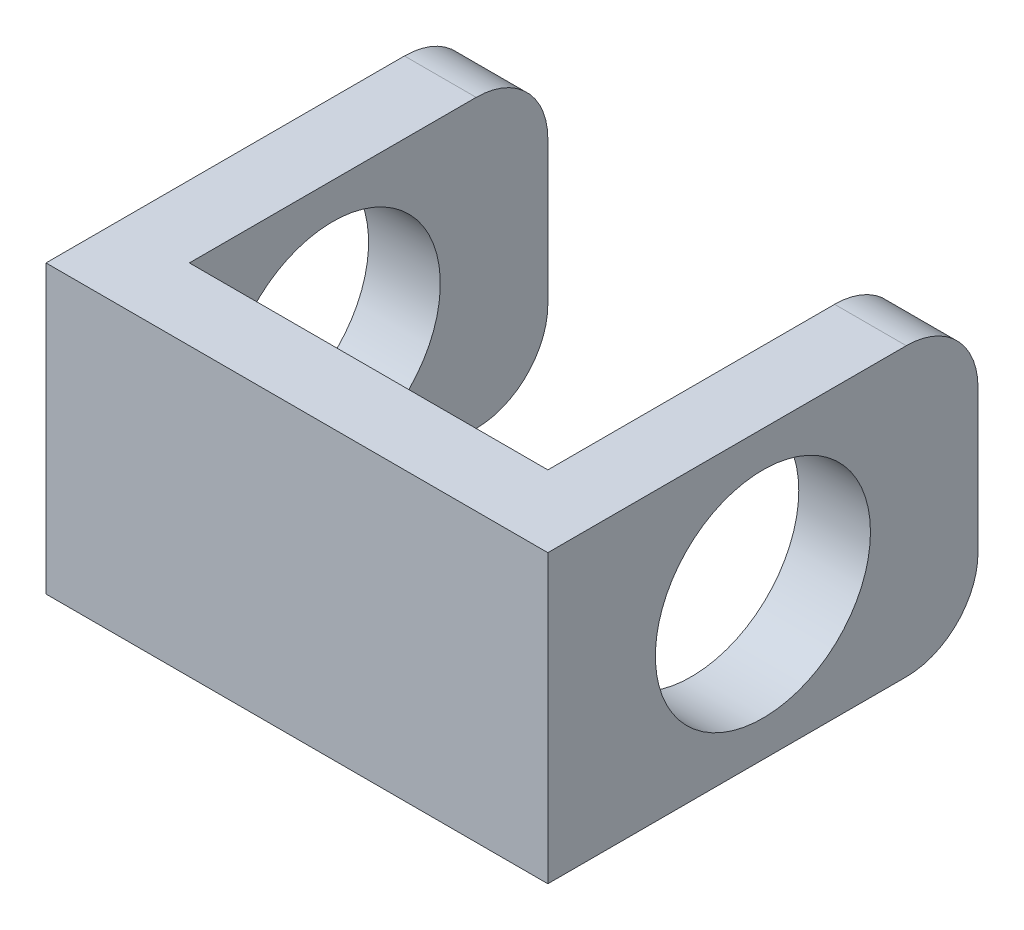
ISO-10303-21;
HEADER;
FILE_DESCRIPTION(('STEP AP214'),'2;1');
FILE_NAME('part.step','',(''),(''),'','','');
FILE_SCHEMA(('AUTOMOTIVE_DESIGN { 1 0 10303 214 1 1 1 1 }'));
ENDSEC;
DATA;
#1=APPLICATION_CONTEXT('core data for automotive mechanical design processes');
#2=APPLICATION_PROTOCOL_DEFINITION('international standard','automotive_design',2000,#1);
#3=PRODUCT_CONTEXT('',#1,'mechanical');
#4=PRODUCT('Part','Part','',(#3));
#5=PRODUCT_RELATED_PRODUCT_CATEGORY('part','',(#4));
#6=PRODUCT_DEFINITION_FORMATION('','',#4);
#7=PRODUCT_DEFINITION_CONTEXT('part definition',#1,'design');
#8=PRODUCT_DEFINITION('design','',#6,#7);
#9=PRODUCT_DEFINITION_SHAPE('','',#8);
#10=(LENGTH_UNIT() NAMED_UNIT(*) SI_UNIT(.MILLI.,.METRE.));
#11=(NAMED_UNIT(*) PLANE_ANGLE_UNIT() SI_UNIT($,.RADIAN.));
#12=(NAMED_UNIT(*) SI_UNIT($,.STERADIAN.) SOLID_ANGLE_UNIT());
#13=UNCERTAINTY_MEASURE_WITH_UNIT(LENGTH_MEASURE(1.E-05),#10,'distance_accuracy_value','');
#14=(GEOMETRIC_REPRESENTATION_CONTEXT(3) GLOBAL_UNCERTAINTY_ASSIGNED_CONTEXT((#13)) GLOBAL_UNIT_ASSIGNED_CONTEXT((#10,
#11,#12)) REPRESENTATION_CONTEXT('',''));
#15=CARTESIAN_POINT('',(0.,0.,0.));
#16=DIRECTION('',(0.,0.,1.));
#17=DIRECTION('',(1.,0.,0.));
#18=AXIS2_PLACEMENT_3D('',#15,#16,#17);
#19=CARTESIAN_POINT('',(0.,0.,0.));
#20=DIRECTION('',(0.,0.,-1.));
#21=DIRECTION('',(-1.,0.,0.));
#22=AXIS2_PLACEMENT_3D('',#19,#20,#21);
#23=PLANE('',#22);
#24=DIRECTION('',(-1.,0.,0.));
#25=VECTOR('',#24,1.);
#26=CARTESIAN_POINT('',(60.,40.,0.));
#27=LINE('',#26,#25);
#28=CARTESIAN_POINT('',(50.,40.,0.));
#29=VERTEX_POINT('',#28);
#30=CARTESIAN_POINT('',(0.,40.,0.));
#31=VERTEX_POINT('',#30);
#32=EDGE_CURVE('E187',#29,#31,#27,.T.);
#33=ORIENTED_EDGE('',*,*,#32,.F.);
#34=DIRECTION('',(0.,1.,0.));
#35=VECTOR('',#34,1.);
#36=CARTESIAN_POINT('',(50.,0.,0.));
#37=LINE('',#36,#35);
#38=CARTESIAN_POINT('',(50.,0.,0.));
#39=VERTEX_POINT('',#38);
#40=EDGE_CURVE('E153',#39,#29,#37,.T.);
#41=ORIENTED_EDGE('',*,*,#40,.F.);
#42=DIRECTION('',(1.,0.,0.));
#43=VECTOR('',#42,1.);
#44=CARTESIAN_POINT('',(60.,0.,0.));
#45=LINE('',#44,#43);
#46=CARTESIAN_POINT('',(0.,0.,0.));
#47=VERTEX_POINT('',#46);
#48=EDGE_CURVE('E189',#47,#39,#45,.T.);
#49=ORIENTED_EDGE('',*,*,#48,.F.);
#50=DIRECTION('',(0.,-1.,0.));
#51=VECTOR('',#50,1.);
#52=CARTESIAN_POINT('',(0.,0.,0.));
#53=LINE('',#52,#51);
#54=EDGE_CURVE('E144',#31,#47,#53,.T.);
#55=ORIENTED_EDGE('',*,*,#54,.F.);
#56=EDGE_LOOP('',(#33,#41,#49,#55));
#57=FACE_BOUND('',#56,.T.);
#58=ADVANCED_FACE('F37',(#57),#23,.T.);
#59=CARTESIAN_POINT('',(-10.,40.,0.));
#60=DIRECTION('',(0.,1.,0.));
#61=DIRECTION('',(0.,0.,1.));
#62=AXIS2_PLACEMENT_3D('',#59,#60,#61);
#63=PLANE('',#62);
#64=ORIENTED_EDGE('',*,*,#32,.T.);
#65=DIRECTION('',(0.,0.,1.));
#66=VECTOR('',#65,1.);
#67=CARTESIAN_POINT('',(0.,40.,0.));
#68=LINE('',#67,#66);
#69=CARTESIAN_POINT('',(0.,40.,-39.9999999999999));
#70=VERTEX_POINT('',#69);
#71=EDGE_CURVE('E204',#70,#31,#68,.T.);
#72=ORIENTED_EDGE('',*,*,#71,.F.);
#73=DIRECTION('',(1.,0.,0.));
#74=VECTOR('',#73,1.);
#75=CARTESIAN_POINT('',(-10.,40.,-39.9999999999999));
#76=LINE('',#75,#74);
#77=CARTESIAN_POINT('',(-10.,40.,-39.9999999999999));
#78=VERTEX_POINT('',#77);
#79=EDGE_CURVE('E11',#78,#70,#76,.T.);
#80=ORIENTED_EDGE('',*,*,#79,.F.);
#81=DIRECTION('',(0.,0.,1.));
#82=VECTOR('',#81,1.);
#83=CARTESIAN_POINT('',(-10.,40.,0.));
#84=LINE('',#83,#82);
#85=CARTESIAN_POINT('',(-10.,40.,10.));
#86=VERTEX_POINT('',#85);
#87=EDGE_CURVE('E210',#78,#86,#84,.T.);
#88=ORIENTED_EDGE('',*,*,#87,.T.);
#89=DIRECTION('',(-1.,0.,0.));
#90=VECTOR('',#89,1.);
#91=CARTESIAN_POINT('',(60.,40.,10.));
#92=LINE('',#91,#90);
#93=CARTESIAN_POINT('',(60.,40.,10.));
#94=VERTEX_POINT('',#93);
#95=EDGE_CURVE('E193',#94,#86,#92,.T.);
#96=ORIENTED_EDGE('',*,*,#95,.F.);
#97=DIRECTION('',(0.,0.,1.));
#98=VECTOR('',#97,1.);
#99=CARTESIAN_POINT('',(60.,40.,0.));
#100=LINE('',#99,#98);
#101=CARTESIAN_POINT('',(60.,40.,-39.9999999999999));
#102=VERTEX_POINT('',#101);
#103=EDGE_CURVE('E145',#102,#94,#100,.T.);
#104=ORIENTED_EDGE('',*,*,#103,.F.);
#105=DIRECTION('',(-1.,0.,0.));
#106=VECTOR('',#105,1.);
#107=CARTESIAN_POINT('',(60.,40.,-39.9999999999999));
#108=LINE('',#107,#106);
#109=CARTESIAN_POINT('',(50.,40.,-39.9999999999999));
#110=VERTEX_POINT('',#109);
#111=EDGE_CURVE('E173',#102,#110,#108,.T.);
#112=ORIENTED_EDGE('',*,*,#111,.T.);
#113=DIRECTION('',(0.,0.,1.));
#114=VECTOR('',#113,1.);
#115=CARTESIAN_POINT('',(50.,40.,10.));
#116=LINE('',#115,#114);
#117=EDGE_CURVE('E160',#110,#29,#116,.T.);
#118=ORIENTED_EDGE('',*,*,#117,.T.);
#119=EDGE_LOOP('',(#64,#72,#80,#88,#96,#104,#112,#118));
#120=FACE_BOUND('',#119,.T.);
#121=ADVANCED_FACE('F241',(#120),#63,.T.);
#122=CARTESIAN_POINT('',(-10.,30.,-40.));
#123=DIRECTION('',(1.,0.,0.));
#124=DIRECTION('',(0.,0.,-1.));
#125=AXIS2_PLACEMENT_3D('',#122,#123,#124);
#126=CYLINDRICAL_SURFACE('',#125,10.);
#127=CARTESIAN_POINT('',(0.,30.,-40.));
#128=DIRECTION('',(1.,0.,0.));
#129=DIRECTION('',(0.,0.,1.));
#130=AXIS2_PLACEMENT_3D('',#127,#128,#129);
#131=CIRCLE('',#130,10.);
#132=CARTESIAN_POINT('',(0.,29.9999999999999,-50.));
#133=VERTEX_POINT('',#132);
#134=EDGE_CURVE('E223',#133,#70,#131,.T.);
#135=ORIENTED_EDGE('',*,*,#134,.F.);
#136=DIRECTION('',(1.,0.,0.));
#137=VECTOR('',#136,1.);
#138=CARTESIAN_POINT('',(-10.,29.9999999999999,-50.));
#139=LINE('',#138,#137);
#140=CARTESIAN_POINT('',(-10.,29.9999999999999,-50.));
#141=VERTEX_POINT('',#140);
#142=EDGE_CURVE('E47',#141,#133,#139,.T.);
#143=ORIENTED_EDGE('',*,*,#142,.F.);
#144=CARTESIAN_POINT('',(-10.,30.,-40.));
#145=DIRECTION('',(1.,0.,0.));
#146=DIRECTION('',(0.,0.,1.));
#147=AXIS2_PLACEMENT_3D('',#144,#145,#146);
#148=CIRCLE('',#147,10.);
#149=EDGE_CURVE('E208',#141,#78,#148,.T.);
#150=ORIENTED_EDGE('',*,*,#149,.T.);
#151=ORIENTED_EDGE('',*,*,#79,.T.);
#152=EDGE_LOOP('',(#135,#143,#150,#151));
#153=FACE_BOUND('',#152,.T.);
#154=ADVANCED_FACE('F260',(#153),#126,.T.);
#155=CARTESIAN_POINT('',(-10.,10.0000000000001,-50.));
#156=DIRECTION('',(0.,0.,-1.));
#157=DIRECTION('',(-1.,0.,0.));
#158=AXIS2_PLACEMENT_3D('',#155,#156,#157);
#159=PLANE('',#158);
#160=DIRECTION('',(0.,1.,0.));
#161=VECTOR('',#160,1.);
#162=CARTESIAN_POINT('',(0.,10.0000000000001,-50.));
#163=LINE('',#162,#161);
#164=CARTESIAN_POINT('',(0.,10.0000000000001,-50.));
#165=VERTEX_POINT('',#164);
#166=EDGE_CURVE('E220',#165,#133,#163,.T.);
#167=ORIENTED_EDGE('',*,*,#166,.F.);
#168=DIRECTION('',(1.,0.,0.));
#169=VECTOR('',#168,1.);
#170=CARTESIAN_POINT('',(-10.,10.0000000000001,-50.));
#171=LINE('',#170,#169);
#172=CARTESIAN_POINT('',(-10.,10.0000000000001,-50.));
#173=VERTEX_POINT('',#172);
#174=EDGE_CURVE('E228',#173,#165,#171,.T.);
#175=ORIENTED_EDGE('',*,*,#174,.F.);
#176=DIRECTION('',(0.,1.,0.));
#177=VECTOR('',#176,1.);
#178=CARTESIAN_POINT('',(-10.,10.0000000000001,-50.));
#179=LINE('',#178,#177);
#180=EDGE_CURVE('E206',#173,#141,#179,.T.);
#181=ORIENTED_EDGE('',*,*,#180,.T.);
#182=ORIENTED_EDGE('',*,*,#142,.T.);
#183=EDGE_LOOP('',(#167,#175,#181,#182));
#184=FACE_BOUND('',#183,.T.);
#185=ADVANCED_FACE('F259',(#184),#159,.T.);
#186=CARTESIAN_POINT('',(-10.,10.,-40.));
#187=DIRECTION('',(1.,0.,0.));
#188=DIRECTION('',(0.,0.,-1.));
#189=AXIS2_PLACEMENT_3D('',#186,#187,#188);
#190=CYLINDRICAL_SURFACE('',#189,10.);
#191=CARTESIAN_POINT('',(0.,10.,-40.));
#192=DIRECTION('',(1.,0.,0.));
#193=DIRECTION('',(0.,0.,1.));
#194=AXIS2_PLACEMENT_3D('',#191,#192,#193);
#195=CIRCLE('',#194,10.);
#196=CARTESIAN_POINT('',(0.,0.,-39.9999999999999));
#197=VERTEX_POINT('',#196);
#198=EDGE_CURVE('E217',#197,#165,#195,.T.);
#199=ORIENTED_EDGE('',*,*,#198,.F.);
#200=DIRECTION('',(1.,0.,0.));
#201=VECTOR('',#200,1.);
#202=CARTESIAN_POINT('',(-10.,0.,-39.9999999999999));
#203=LINE('',#202,#201);
#204=CARTESIAN_POINT('',(-10.,0.,-39.9999999999999));
#205=VERTEX_POINT('',#204);
#206=EDGE_CURVE('E84',#205,#197,#203,.T.);
#207=ORIENTED_EDGE('',*,*,#206,.F.);
#208=CARTESIAN_POINT('',(-10.,10.,-40.));
#209=DIRECTION('',(1.,0.,0.));
#210=DIRECTION('',(0.,0.,1.));
#211=AXIS2_PLACEMENT_3D('',#208,#209,#210);
#212=CIRCLE('',#211,10.);
#213=EDGE_CURVE('E203',#205,#173,#212,.T.);
#214=ORIENTED_EDGE('',*,*,#213,.T.);
#215=ORIENTED_EDGE('',*,*,#174,.T.);
#216=EDGE_LOOP('',(#199,#207,#214,#215));
#217=FACE_BOUND('',#216,.T.);
#218=ADVANCED_FACE('F230',(#217),#190,.T.);
#219=CARTESIAN_POINT('',(-10.,0.,0.));
#220=DIRECTION('',(0.,-1.,0.));
#221=DIRECTION('',(0.,0.,-1.));
#222=AXIS2_PLACEMENT_3D('',#219,#220,#221);
#223=PLANE('',#222);
#224=DIRECTION('',(0.,0.,1.));
#225=VECTOR('',#224,1.);
#226=CARTESIAN_POINT('',(60.,0.,0.));
#227=LINE('',#226,#225);
#228=CARTESIAN_POINT('',(60.,0.,-39.9999999999999));
#229=VERTEX_POINT('',#228);
#230=CARTESIAN_POINT('',(60.,0.,10.));
#231=VERTEX_POINT('',#230);
#232=EDGE_CURVE('E134',#229,#231,#227,.T.);
#233=ORIENTED_EDGE('',*,*,#232,.T.);
#234=DIRECTION('',(1.,0.,0.));
#235=VECTOR('',#234,1.);
#236=CARTESIAN_POINT('',(60.,0.,10.));
#237=LINE('',#236,#235);
#238=CARTESIAN_POINT('',(-10.,0.,10.));
#239=VERTEX_POINT('',#238);
#240=EDGE_CURVE('E190',#239,#231,#237,.T.);
#241=ORIENTED_EDGE('',*,*,#240,.F.);
#242=DIRECTION('',(0.,0.,-1.));
#243=VECTOR('',#242,1.);
#244=CARTESIAN_POINT('',(-10.,0.,0.));
#245=LINE('',#244,#243);
#246=EDGE_CURVE('E200',#239,#205,#245,.T.);
#247=ORIENTED_EDGE('',*,*,#246,.T.);
#248=ORIENTED_EDGE('',*,*,#206,.T.);
#249=DIRECTION('',(0.,0.,-1.));
#250=VECTOR('',#249,1.);
#251=CARTESIAN_POINT('',(0.,0.,0.));
#252=LINE('',#251,#250);
#253=EDGE_CURVE('E214',#47,#197,#252,.T.);
#254=ORIENTED_EDGE('',*,*,#253,.F.);
#255=ORIENTED_EDGE('',*,*,#48,.T.);
#256=DIRECTION('',(0.,0.,-1.));
#257=VECTOR('',#256,1.);
#258=CARTESIAN_POINT('',(50.,0.,10.));
#259=LINE('',#258,#257);
#260=CARTESIAN_POINT('',(50.,0.,-39.9999999999999));
#261=VERTEX_POINT('',#260);
#262=EDGE_CURVE('E150',#39,#261,#259,.T.);
#263=ORIENTED_EDGE('',*,*,#262,.T.);
#264=DIRECTION('',(-1.,0.,0.));
#265=VECTOR('',#264,1.);
#266=CARTESIAN_POINT('',(60.,0.,-39.9999999999999));
#267=LINE('',#266,#265);
#268=EDGE_CURVE('E148',#229,#261,#267,.T.);
#269=ORIENTED_EDGE('',*,*,#268,.F.);
#270=EDGE_LOOP('',(#233,#241,#247,#248,#254,#255,#263,#269));
#271=FACE_BOUND('',#270,.T.);
#272=ADVANCED_FACE('F39',(#271),#223,.T.);
#273=CARTESIAN_POINT('',(-10.,30.,-40.));
#274=DIRECTION('',(-1.,0.,0.));
#275=DIRECTION('',(0.,0.,1.));
#276=AXIS2_PLACEMENT_3D('',#273,#274,#275);
#277=PLANE('',#276);
#278=CARTESIAN_POINT('',(-9.99999999999999,20.,-20.));
#279=DIRECTION('',(-1.,0.,0.));
#280=DIRECTION('',(0.,0.,1.));
#281=AXIS2_PLACEMENT_3D('',#278,#279,#280);
#282=CIRCLE('',#281,15.);
#283=CARTESIAN_POINT('',(-9.99999999999999,20.,-5.00000000000001));
#284=VERTEX_POINT('',#283);
#285=EDGE_CURVE('E168',#284,#284,#282,.T.);
#286=ORIENTED_EDGE('',*,*,#285,.F.);
#287=EDGE_LOOP('',(#286));
#288=FACE_BOUND('',#287,.T.);
#289=ORIENTED_EDGE('',*,*,#246,.F.);
#290=DIRECTION('',(0.,-1.,0.));
#291=VECTOR('',#290,1.);
#292=CARTESIAN_POINT('',(-10.,40.,10.));
#293=LINE('',#292,#291);
#294=EDGE_CURVE('E195',#86,#239,#293,.T.);
#295=ORIENTED_EDGE('',*,*,#294,.F.);
#296=ORIENTED_EDGE('',*,*,#87,.F.);
#297=ORIENTED_EDGE('',*,*,#149,.F.);
#298=ORIENTED_EDGE('',*,*,#180,.F.);
#299=ORIENTED_EDGE('',*,*,#213,.F.);
#300=EDGE_LOOP('',(#289,#295,#296,#297,#298,#299));
#301=FACE_BOUND('',#300,.T.);
#302=ADVANCED_FACE('F256',(#288,#301),#277,.T.);
#303=CARTESIAN_POINT('',(0.,30.,-40.));
#304=DIRECTION('',(-1.,0.,0.));
#305=DIRECTION('',(0.,0.,1.));
#306=AXIS2_PLACEMENT_3D('',#303,#304,#305);
#307=PLANE('',#306);
#308=CARTESIAN_POINT('',(0.,20.,-20.));
#309=DIRECTION('',(-1.,0.,0.));
#310=DIRECTION('',(0.,0.,1.));
#311=AXIS2_PLACEMENT_3D('',#308,#309,#310);
#312=CIRCLE('',#311,15.);
#313=CARTESIAN_POINT('',(0.,20.,-5.00000000000001));
#314=VERTEX_POINT('',#313);
#315=EDGE_CURVE('E290',#314,#314,#312,.T.);
#316=ORIENTED_EDGE('',*,*,#315,.T.);
#317=EDGE_LOOP('',(#316));
#318=FACE_BOUND('',#317,.T.);
#319=ORIENTED_EDGE('',*,*,#54,.T.);
#320=ORIENTED_EDGE('',*,*,#253,.T.);
#321=ORIENTED_EDGE('',*,*,#198,.T.);
#322=ORIENTED_EDGE('',*,*,#166,.T.);
#323=ORIENTED_EDGE('',*,*,#134,.T.);
#324=ORIENTED_EDGE('',*,*,#71,.T.);
#325=EDGE_LOOP('',(#319,#320,#321,#322,#323,#324));
#326=FACE_BOUND('',#325,.T.);
#327=ADVANCED_FACE('F232',(#318,#326),#307,.F.);
#328=CARTESIAN_POINT('',(60.,40.,0.));
#329=DIRECTION('',(1.,0.,0.));
#330=DIRECTION('',(0.,0.,-1.));
#331=AXIS2_PLACEMENT_3D('',#328,#329,#330);
#332=PLANE('',#331);
#333=CARTESIAN_POINT('',(60.,20.,-20.));
#334=DIRECTION('',(1.,0.,0.));
#335=DIRECTION('',(0.,0.,-1.));
#336=AXIS2_PLACEMENT_3D('',#333,#334,#335);
#337=CIRCLE('',#336,15.);
#338=CARTESIAN_POINT('',(60.,20.,-35.));
#339=VERTEX_POINT('',#338);
#340=EDGE_CURVE('E294',#339,#339,#337,.T.);
#341=ORIENTED_EDGE('',*,*,#340,.F.);
#342=EDGE_LOOP('',(#341));
#343=FACE_BOUND('',#342,.T.);
#344=DIRECTION('',(0.,1.,0.));
#345=VECTOR('',#344,1.);
#346=CARTESIAN_POINT('',(60.,40.,10.));
#347=LINE('',#346,#345);
#348=EDGE_CURVE('E141',#231,#94,#347,.T.);
#349=ORIENTED_EDGE('',*,*,#348,.F.);
#350=ORIENTED_EDGE('',*,*,#232,.F.);
#351=CARTESIAN_POINT('',(60.,10.,-40.));
#352=DIRECTION('',(1.,0.,0.));
#353=DIRECTION('',(0.,0.,-1.));
#354=AXIS2_PLACEMENT_3D('',#351,#352,#353);
#355=CIRCLE('',#354,10.);
#356=CARTESIAN_POINT('',(60.,10.0000000000001,-50.));
#357=VERTEX_POINT('',#356);
#358=EDGE_CURVE('E138',#229,#357,#355,.T.);
#359=ORIENTED_EDGE('',*,*,#358,.T.);
#360=DIRECTION('',(0.,1.,0.));
#361=VECTOR('',#360,1.);
#362=CARTESIAN_POINT('',(60.,29.9999999999999,-50.));
#363=LINE('',#362,#361);
#364=CARTESIAN_POINT('',(60.,29.9999999999999,-50.));
#365=VERTEX_POINT('',#364);
#366=EDGE_CURVE('E159',#357,#365,#363,.T.);
#367=ORIENTED_EDGE('',*,*,#366,.T.);
#368=CARTESIAN_POINT('',(60.,30.,-40.));
#369=DIRECTION('',(1.,0.,0.));
#370=DIRECTION('',(0.,0.,-1.));
#371=AXIS2_PLACEMENT_3D('',#368,#369,#370);
#372=CIRCLE('',#371,10.);
#373=EDGE_CURVE('E162',#365,#102,#372,.T.);
#374=ORIENTED_EDGE('',*,*,#373,.T.);
#375=ORIENTED_EDGE('',*,*,#103,.T.);
#376=EDGE_LOOP('',(#349,#350,#359,#367,#374,#375));
#377=FACE_BOUND('',#376,.T.);
#378=ADVANCED_FACE('F136',(#343,#377),#332,.T.);
#379=CARTESIAN_POINT('',(0.,0.,10.));
#380=DIRECTION('',(0.,0.,-1.));
#381=DIRECTION('',(-1.,0.,0.));
#382=AXIS2_PLACEMENT_3D('',#379,#380,#381);
#383=PLANE('',#382);
#384=ORIENTED_EDGE('',*,*,#95,.T.);
#385=ORIENTED_EDGE('',*,*,#294,.T.);
#386=ORIENTED_EDGE('',*,*,#240,.T.);
#387=ORIENTED_EDGE('',*,*,#348,.T.);
#388=EDGE_LOOP('',(#384,#385,#386,#387));
#389=FACE_BOUND('',#388,.T.);
#390=ADVANCED_FACE('F254',(#389),#383,.F.);
#391=CARTESIAN_POINT('',(50.,10.,-40.));
#392=DIRECTION('',(1.,0.,0.));
#393=DIRECTION('',(0.,0.,-1.));
#394=AXIS2_PLACEMENT_3D('',#391,#392,#393);
#395=PLANE('',#394);
#396=CARTESIAN_POINT('',(50.,20.,-20.));
#397=DIRECTION('',(1.,0.,0.));
#398=DIRECTION('',(0.,0.,-1.));
#399=AXIS2_PLACEMENT_3D('',#396,#397,#398);
#400=CIRCLE('',#399,15.);
#401=CARTESIAN_POINT('',(50.,20.,-35.));
#402=VERTEX_POINT('',#401);
#403=EDGE_CURVE('E41',#402,#402,#400,.T.);
#404=ORIENTED_EDGE('',*,*,#403,.T.);
#405=EDGE_LOOP('',(#404));
#406=FACE_BOUND('',#405,.T.);
#407=ORIENTED_EDGE('',*,*,#262,.F.);
#408=ORIENTED_EDGE('',*,*,#40,.T.);
#409=ORIENTED_EDGE('',*,*,#117,.F.);
#410=CARTESIAN_POINT('',(50.,30.,-40.));
#411=DIRECTION('',(1.,0.,0.));
#412=DIRECTION('',(0.,0.,-1.));
#413=AXIS2_PLACEMENT_3D('',#410,#411,#412);
#414=CIRCLE('',#413,10.);
#415=CARTESIAN_POINT('',(50.,29.9999999999999,-50.));
#416=VERTEX_POINT('',#415);
#417=EDGE_CURVE('E165',#416,#110,#414,.T.);
#418=ORIENTED_EDGE('',*,*,#417,.F.);
#419=DIRECTION('',(0.,1.,0.));
#420=VECTOR('',#419,1.);
#421=CARTESIAN_POINT('',(50.,29.9999999999999,-50.));
#422=LINE('',#421,#420);
#423=CARTESIAN_POINT('',(50.,10.0000000000001,-50.));
#424=VERTEX_POINT('',#423);
#425=EDGE_CURVE('E177',#424,#416,#422,.T.);
#426=ORIENTED_EDGE('',*,*,#425,.F.);
#427=CARTESIAN_POINT('',(50.,10.,-40.));
#428=DIRECTION('',(1.,0.,0.));
#429=DIRECTION('',(0.,0.,-1.));
#430=AXIS2_PLACEMENT_3D('',#427,#428,#429);
#431=CIRCLE('',#430,10.);
#432=EDGE_CURVE('E175',#261,#424,#431,.T.);
#433=ORIENTED_EDGE('',*,*,#432,.F.);
#434=EDGE_LOOP('',(#407,#408,#409,#418,#426,#433));
#435=FACE_BOUND('',#434,.T.);
#436=ADVANCED_FACE('F239',(#406,#435),#395,.F.);
#437=CARTESIAN_POINT('',(60.,10.,-40.));
#438=DIRECTION('',(-1.,0.,0.));
#439=DIRECTION('',(0.,0.,1.));
#440=AXIS2_PLACEMENT_3D('',#437,#438,#439);
#441=CYLINDRICAL_SURFACE('',#440,10.);
#442=ORIENTED_EDGE('',*,*,#432,.T.);
#443=DIRECTION('',(-1.,0.,0.));
#444=VECTOR('',#443,1.);
#445=CARTESIAN_POINT('',(60.,10.0000000000001,-50.));
#446=LINE('',#445,#444);
#447=EDGE_CURVE('E154',#357,#424,#446,.T.);
#448=ORIENTED_EDGE('',*,*,#447,.F.);
#449=ORIENTED_EDGE('',*,*,#358,.F.);
#450=ORIENTED_EDGE('',*,*,#268,.T.);
#451=EDGE_LOOP('',(#442,#448,#449,#450));
#452=FACE_BOUND('',#451,.T.);
#453=ADVANCED_FACE('F156',(#452),#441,.T.);
#454=CARTESIAN_POINT('',(60.,29.9999999999999,-50.));
#455=DIRECTION('',(0.,0.,1.));
#456=DIRECTION('',(1.,0.,0.));
#457=AXIS2_PLACEMENT_3D('',#454,#455,#456);
#458=PLANE('',#457);
#459=ORIENTED_EDGE('',*,*,#425,.T.);
#460=DIRECTION('',(-1.,0.,0.));
#461=VECTOR('',#460,1.);
#462=CARTESIAN_POINT('',(60.,29.9999999999999,-50.));
#463=LINE('',#462,#461);
#464=EDGE_CURVE('E182',#365,#416,#463,.T.);
#465=ORIENTED_EDGE('',*,*,#464,.F.);
#466=ORIENTED_EDGE('',*,*,#366,.F.);
#467=ORIENTED_EDGE('',*,*,#447,.T.);
#468=EDGE_LOOP('',(#459,#465,#466,#467));
#469=FACE_BOUND('',#468,.T.);
#470=ADVANCED_FACE('F250',(#469),#458,.F.);
#471=CARTESIAN_POINT('',(60.,30.,-40.));
#472=DIRECTION('',(-1.,0.,0.));
#473=DIRECTION('',(0.,0.,1.));
#474=AXIS2_PLACEMENT_3D('',#471,#472,#473);
#475=CYLINDRICAL_SURFACE('',#474,10.);
#476=ORIENTED_EDGE('',*,*,#417,.T.);
#477=ORIENTED_EDGE('',*,*,#111,.F.);
#478=ORIENTED_EDGE('',*,*,#373,.F.);
#479=ORIENTED_EDGE('',*,*,#464,.T.);
#480=EDGE_LOOP('',(#476,#477,#478,#479));
#481=FACE_BOUND('',#480,.T.);
#482=ADVANCED_FACE('F246',(#481),#475,.T.);
#483=CARTESIAN_POINT('',(-80.,20.,-20.));
#484=DIRECTION('',(1.,0.,0.));
#485=DIRECTION('',(0.,0.,-1.));
#486=AXIS2_PLACEMENT_3D('',#483,#484,#485);
#487=CYLINDRICAL_SURFACE('',#486,15.);
#488=ORIENTED_EDGE('',*,*,#340,.T.);
#489=EDGE_LOOP('',(#488));
#490=FACE_BOUND('',#489,.T.);
#491=ORIENTED_EDGE('',*,*,#403,.F.);
#492=EDGE_LOOP('',(#491));
#493=FACE_BOUND('',#492,.T.);
#494=ADVANCED_FACE('F299',(#490,#493),#487,.F.);
#495=ORIENTED_EDGE('',*,*,#285,.T.);
#496=EDGE_LOOP('',(#495));
#497=FACE_BOUND('',#496,.T.);
#498=ORIENTED_EDGE('',*,*,#315,.F.);
#499=EDGE_LOOP('',(#498));
#500=FACE_BOUND('',#499,.T.);
#501=ADVANCED_FACE('F302',(#497,#500),#487,.F.);
#502=CLOSED_SHELL('',(#58,#121,#154,#185,#218,#272,#302,#327,#378,#390,#436,#453,#470,#482,#494,#501));
#503=MANIFOLD_SOLID_BREP('B2',#502);
#504=ADVANCED_BREP_SHAPE_REPRESENTATION('',(#18,#503),#14);
#505=SHAPE_DEFINITION_REPRESENTATION(#9,#504);
ENDSEC;
END-ISO-10303-21;
